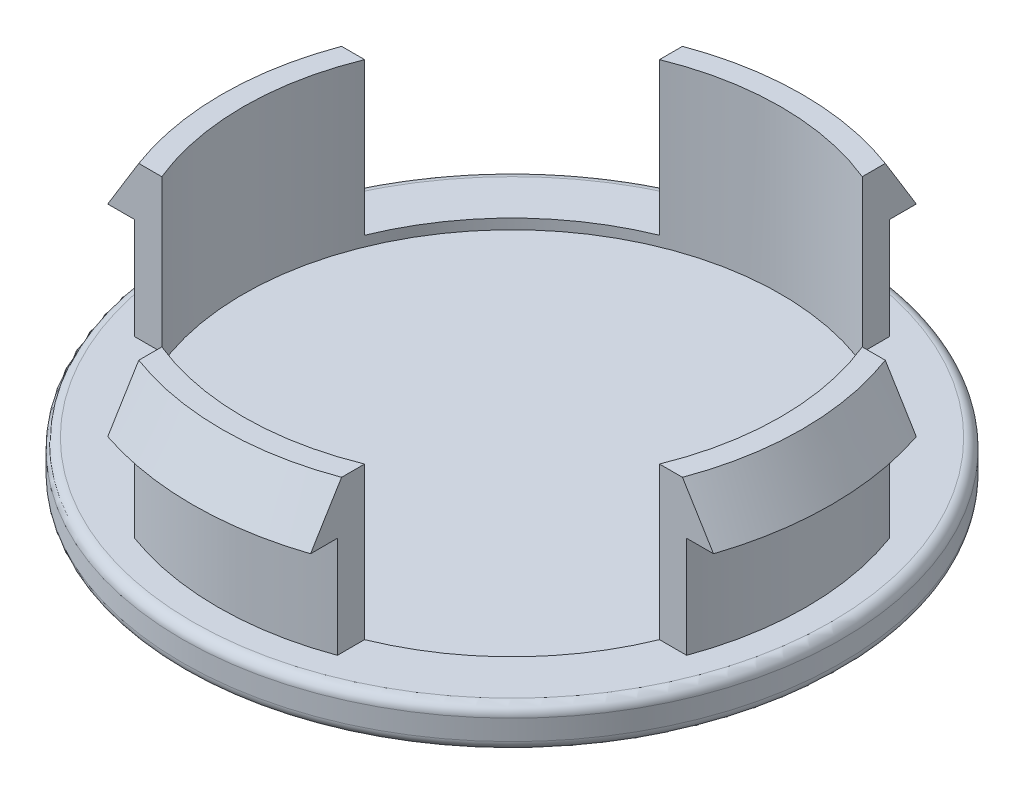
ISO-10303-21;
HEADER;
FILE_DESCRIPTION(('STEP AP214'),'2;1');
FILE_NAME('part.step','',(''),(''),'','','');
FILE_SCHEMA(('AUTOMOTIVE_DESIGN { 1 0 10303 214 1 1 1 1 }'));
ENDSEC;
DATA;
#1=APPLICATION_CONTEXT('core data for automotive mechanical design processes');
#2=APPLICATION_PROTOCOL_DEFINITION('international standard','automotive_design',2000,#1);
#3=PRODUCT_CONTEXT('',#1,'mechanical');
#4=PRODUCT('Part','Part','',(#3));
#5=PRODUCT_RELATED_PRODUCT_CATEGORY('part','',(#4));
#6=PRODUCT_DEFINITION_FORMATION('','',#4);
#7=PRODUCT_DEFINITION_CONTEXT('part definition',#1,'design');
#8=PRODUCT_DEFINITION('design','',#6,#7);
#9=PRODUCT_DEFINITION_SHAPE('','',#8);
#10=(LENGTH_UNIT() NAMED_UNIT(*) SI_UNIT(.MILLI.,.METRE.));
#11=(NAMED_UNIT(*) PLANE_ANGLE_UNIT() SI_UNIT($,.RADIAN.));
#12=(NAMED_UNIT(*) SI_UNIT($,.STERADIAN.) SOLID_ANGLE_UNIT());
#13=UNCERTAINTY_MEASURE_WITH_UNIT(LENGTH_MEASURE(1.E-05),#10,'distance_accuracy_value','');
#14=(GEOMETRIC_REPRESENTATION_CONTEXT(3) GLOBAL_UNCERTAINTY_ASSIGNED_CONTEXT((#13)) GLOBAL_UNIT_ASSIGNED_CONTEXT((#10,
#11,#12)) REPRESENTATION_CONTEXT('',''));
#15=CARTESIAN_POINT('',(0.,0.,0.));
#16=DIRECTION('',(0.,0.,1.));
#17=DIRECTION('',(1.,0.,0.));
#18=AXIS2_PLACEMENT_3D('',#15,#16,#17);
#19=CARTESIAN_POINT('',(0.,0.,0.));
#20=DIRECTION('',(0.,1.,0.));
#21=DIRECTION('',(0.,0.,1.));
#22=AXIS2_PLACEMENT_3D('',#19,#20,#21);
#23=CYLINDRICAL_SURFACE('',#22,26.5);
#24=CARTESIAN_POINT('',(0.,3.,0.));
#25=DIRECTION('',(0.,1.,0.));
#26=DIRECTION('',(0.,0.,1.));
#27=AXIS2_PLACEMENT_3D('',#24,#25,#26);
#28=CIRCLE('',#27,26.5);
#29=CARTESIAN_POINT('',(0.,3.,26.5));
#30=VERTEX_POINT('',#29);
#31=EDGE_CURVE('E11',#30,#30,#28,.T.);
#32=ORIENTED_EDGE('',*,*,#31,.F.);
#33=EDGE_LOOP('',(#32));
#34=FACE_BOUND('',#33,.T.);
#35=CARTESIAN_POINT('',(0.,19.,0.));
#36=DIRECTION('',(0.,1.,0.));
#37=DIRECTION('',(0.,0.,1.));
#38=AXIS2_PLACEMENT_3D('',#35,#36,#37);
#39=CIRCLE('',#38,26.5);
#40=CARTESIAN_POINT('',(10.,19.,-24.5407823836161));
#41=VERTEX_POINT('',#40);
#42=CARTESIAN_POINT('',(-10.,19.,-24.5407823836161));
#43=VERTEX_POINT('',#42);
#44=EDGE_CURVE('E45',#41,#43,#39,.T.);
#45=ORIENTED_EDGE('',*,*,#44,.T.);
#46=DIRECTION('',(0.,1.,0.));
#47=VECTOR('',#46,1.);
#48=CARTESIAN_POINT('',(-10.,-39.6378852958112,-24.5407823836161));
#49=LINE('',#48,#47);
#50=CARTESIAN_POINT('',(-10.,4.,-24.5407823836161));
#51=VERTEX_POINT('',#50);
#52=EDGE_CURVE('E220',#51,#43,#49,.T.);
#53=ORIENTED_EDGE('',*,*,#52,.F.);
#54=CARTESIAN_POINT('',(0.,4.,0.));
#55=DIRECTION('',(0.,1.,0.));
#56=DIRECTION('',(0.,0.,1.));
#57=AXIS2_PLACEMENT_3D('',#54,#55,#56);
#58=CIRCLE('',#57,26.5);
#59=CARTESIAN_POINT('',(-24.5407823836161,4.,-9.99999999999999));
#60=VERTEX_POINT('',#59);
#61=EDGE_CURVE('E219',#51,#60,#58,.T.);
#62=ORIENTED_EDGE('',*,*,#61,.T.);
#63=DIRECTION('',(0.,1.,0.));
#64=VECTOR('',#63,1.);
#65=CARTESIAN_POINT('',(-24.5407823836161,-39.6378852958112,-9.99999999999999));
#66=LINE('',#65,#64);
#67=CARTESIAN_POINT('',(-24.5407823836161,19.,-9.99999999999999));
#68=VERTEX_POINT('',#67);
#69=EDGE_CURVE('E204',#60,#68,#66,.T.);
#70=ORIENTED_EDGE('',*,*,#69,.T.);
#71=CARTESIAN_POINT('',(-24.5407823836161,19.,10.));
#72=VERTEX_POINT('',#71);
#73=EDGE_CURVE('E216',#68,#72,#39,.T.);
#74=ORIENTED_EDGE('',*,*,#73,.T.);
#75=DIRECTION('',(0.,1.,0.));
#76=VECTOR('',#75,1.);
#77=CARTESIAN_POINT('',(-24.5407823836161,-39.6378852958112,10.));
#78=LINE('',#77,#76);
#79=CARTESIAN_POINT('',(-24.5407823836161,4.,10.));
#80=VERTEX_POINT('',#79);
#81=EDGE_CURVE('E517',#80,#72,#78,.T.);
#82=ORIENTED_EDGE('',*,*,#81,.F.);
#83=CARTESIAN_POINT('',(0.,4.,0.));
#84=DIRECTION('',(0.,1.,0.));
#85=DIRECTION('',(0.,0.,1.));
#86=AXIS2_PLACEMENT_3D('',#83,#84,#85);
#87=CIRCLE('',#86,26.5);
#88=CARTESIAN_POINT('',(-9.99999999999999,4.,24.5407823836161));
#89=VERTEX_POINT('',#88);
#90=EDGE_CURVE('E532',#80,#89,#87,.T.);
#91=ORIENTED_EDGE('',*,*,#90,.T.);
#92=DIRECTION('',(0.,1.,0.));
#93=VECTOR('',#92,1.);
#94=CARTESIAN_POINT('',(-9.99999999999999,-39.6378852958112,24.5407823836161));
#95=LINE('',#94,#93);
#96=CARTESIAN_POINT('',(-9.99999999999999,19.,24.5407823836161));
#97=VERTEX_POINT('',#96);
#98=EDGE_CURVE('E515',#89,#97,#95,.T.);
#99=ORIENTED_EDGE('',*,*,#98,.T.);
#100=CARTESIAN_POINT('',(10.,19.,24.5407823836161));
#101=VERTEX_POINT('',#100);
#102=EDGE_CURVE('E226',#97,#101,#39,.T.);
#103=ORIENTED_EDGE('',*,*,#102,.T.);
#104=DIRECTION('',(0.,1.,0.));
#105=VECTOR('',#104,1.);
#106=CARTESIAN_POINT('',(10.,-39.6378852958112,24.5407823836161));
#107=LINE('',#106,#105);
#108=CARTESIAN_POINT('',(10.,4.,24.5407823836161));
#109=VERTEX_POINT('',#108);
#110=EDGE_CURVE('E494',#109,#101,#107,.T.);
#111=ORIENTED_EDGE('',*,*,#110,.F.);
#112=CARTESIAN_POINT('',(0.,4.,0.));
#113=DIRECTION('',(0.,1.,0.));
#114=DIRECTION('',(0.,0.,1.));
#115=AXIS2_PLACEMENT_3D('',#112,#113,#114);
#116=CIRCLE('',#115,26.5);
#117=CARTESIAN_POINT('',(24.5407823836161,4.,10.));
#118=VERTEX_POINT('',#117);
#119=EDGE_CURVE('E496',#109,#118,#116,.T.);
#120=ORIENTED_EDGE('',*,*,#119,.T.);
#121=DIRECTION('',(0.,1.,0.));
#122=VECTOR('',#121,1.);
#123=CARTESIAN_POINT('',(24.5407823836161,-39.6378852958112,10.));
#124=LINE('',#123,#122);
#125=CARTESIAN_POINT('',(24.5407823836161,19.,10.));
#126=VERTEX_POINT('',#125);
#127=EDGE_CURVE('E504',#118,#126,#124,.T.);
#128=ORIENTED_EDGE('',*,*,#127,.T.);
#129=CARTESIAN_POINT('',(24.5407823836161,19.,-10.));
#130=VERTEX_POINT('',#129);
#131=EDGE_CURVE('E227',#126,#130,#39,.T.);
#132=ORIENTED_EDGE('',*,*,#131,.T.);
#133=DIRECTION('',(0.,1.,0.));
#134=VECTOR('',#133,1.);
#135=CARTESIAN_POINT('',(24.5407823836161,-39.6378852958112,-10.));
#136=LINE('',#135,#134);
#137=CARTESIAN_POINT('',(24.5407823836161,4.,-10.));
#138=VERTEX_POINT('',#137);
#139=EDGE_CURVE('E374',#138,#130,#136,.T.);
#140=ORIENTED_EDGE('',*,*,#139,.F.);
#141=CARTESIAN_POINT('',(0.,4.,0.));
#142=DIRECTION('',(0.,1.,0.));
#143=DIRECTION('',(0.,0.,1.));
#144=AXIS2_PLACEMENT_3D('',#141,#142,#143);
#145=CIRCLE('',#144,26.5);
#146=CARTESIAN_POINT('',(10.,4.,-24.5407823836161));
#147=VERTEX_POINT('',#146);
#148=EDGE_CURVE('E371',#138,#147,#145,.T.);
#149=ORIENTED_EDGE('',*,*,#148,.T.);
#150=DIRECTION('',(0.,1.,0.));
#151=VECTOR('',#150,1.);
#152=CARTESIAN_POINT('',(10.,-39.6378852958112,-24.5407823836161));
#153=LINE('',#152,#151);
#154=EDGE_CURVE('E377',#147,#41,#153,.T.);
#155=ORIENTED_EDGE('',*,*,#154,.T.);
#156=EDGE_LOOP('',(#45,#53,#62,#70,#74,#82,#91,#99,#103,#111,#120,#128,#132,#140,#149,#155));
#157=FACE_BOUND('',#156,.T.);
#158=ADVANCED_FACE('F37',(#34,#157),#23,.F.);
#159=CARTESIAN_POINT('',(-28.6132486540518,19.,0.));
#160=DIRECTION('',(0.,1.,0.));
#161=DIRECTION('',(0.,0.,1.));
#162=AXIS2_PLACEMENT_3D('',#159,#160,#161);
#163=PLANE('',#162);
#164=CARTESIAN_POINT('',(0.,19.,0.));
#165=DIRECTION('',(0.,1.,0.));
#166=DIRECTION('',(0.,0.,1.));
#167=AXIS2_PLACEMENT_3D('',#164,#165,#166);
#168=CIRCLE('',#167,28.6132486540518);
#169=CARTESIAN_POINT('',(10.,19.,-26.8089163999331));
#170=VERTEX_POINT('',#169);
#171=CARTESIAN_POINT('',(-10.,19.,-26.8089163999331));
#172=VERTEX_POINT('',#171);
#173=EDGE_CURVE('E229',#170,#172,#168,.T.);
#174=ORIENTED_EDGE('',*,*,#173,.T.);
#175=DIRECTION('',(0.,0.,1.));
#176=VECTOR('',#175,1.);
#177=CARTESIAN_POINT('',(-9.99999999999999,19.,0.));
#178=LINE('',#177,#176);
#179=EDGE_CURVE('E211',#172,#43,#178,.T.);
#180=ORIENTED_EDGE('',*,*,#179,.T.);
#181=ORIENTED_EDGE('',*,*,#44,.F.);
#182=DIRECTION('',(0.,0.,1.));
#183=VECTOR('',#182,1.);
#184=CARTESIAN_POINT('',(9.99999999999999,19.,0.));
#185=LINE('',#184,#183);
#186=EDGE_CURVE('E379',#170,#41,#185,.T.);
#187=ORIENTED_EDGE('',*,*,#186,.F.);
#188=EDGE_LOOP('',(#174,#180,#181,#187));
#189=FACE_BOUND('',#188,.T.);
#190=ADVANCED_FACE('F326',(#189),#163,.T.);
#191=CARTESIAN_POINT('',(0.,19.,0.));
#192=DIRECTION('',(0.,-1.,0.));
#193=DIRECTION('',(0.,0.,-1.));
#194=AXIS2_PLACEMENT_3D('',#191,#192,#193);
#195=CONICAL_SURFACE('',#194,28.6132486540518,0.523598775598303);
#196=CARTESIAN_POINT('',(0.,14.,0.));
#197=DIRECTION('',(0.,1.,0.));
#198=DIRECTION('',(0.,0.,1.));
#199=AXIS2_PLACEMENT_3D('',#196,#197,#198);
#200=CIRCLE('',#199,31.5);
#201=CARTESIAN_POINT('',(9.99999999999999,14.,-29.8705540624877));
#202=VERTEX_POINT('',#201);
#203=CARTESIAN_POINT('',(-10.,14.,-29.8705540624877));
#204=VERTEX_POINT('',#203);
#205=EDGE_CURVE('E234',#202,#204,#200,.T.);
#206=ORIENTED_EDGE('',*,*,#205,.T.);
#207=CARTESIAN_POINT('',(-10.,0.53803371769992,-37.9777721794444));
#208=CARTESIAN_POINT('',(-10.,1.71069904858378,-37.2776349244702));
#209=CARTESIAN_POINT('',(-10.,2.88283064665295,-36.5766018971294));
#210=CARTESIAN_POINT('',(-10.,5.22577921730675,-35.1723414017115));
#211=CARTESIAN_POINT('',(-10.,6.39659618923228,-34.4691139325349));
#212=CARTESIAN_POINT('',(-10.,8.73660645610639,-33.060098917814));
#213=CARTESIAN_POINT('',(-10.,9.90579983215849,-32.3543115070117));
#214=CARTESIAN_POINT('',(-10.,12.2422864300774,-30.9395986679945));
#215=CARTESIAN_POINT('',(-10.,13.4095796530463,-30.2306732416007));
#216=CARTESIAN_POINT('',(-10.,15.7418796152031,-28.8089553369));
#217=CARTESIAN_POINT('',(-10.,16.9068862522619,-28.0961626909877));
#218=CARTESIAN_POINT('',(-10.,19.2339730871932,-26.6658236976814));
#219=CARTESIAN_POINT('',(-10.,20.3960532991588,-25.9482773732411));
#220=CARTESIAN_POINT('',(-10.,22.1364000776036,-24.8674228954663));
#221=CARTESIAN_POINT('',(-10.,22.7160690395561,-24.506372420491));
#222=CARTESIAN_POINT('',(-10.,23.8743364527512,-23.7825593471346));
#223=CARTESIAN_POINT('',(-10.,24.4529349052358,-23.4197967507415));
#224=CARTESIAN_POINT('',(-10.,25.6089173541076,-22.6923200552483));
#225=CARTESIAN_POINT('',(-10.,26.1863013307351,-22.3276059247333));
#226=CARTESIAN_POINT('',(-10.,27.3396479877337,-21.5959325867297));
#227=CARTESIAN_POINT('',(-10.,27.915610662407,-21.2289733702614));
#228=CARTESIAN_POINT('',(-10.,28.490761639856,-20.8607433765375));
#229=B_SPLINE_CURVE_WITH_KNOTS('',3,(#207,#208,#209,#210,#211,#212,#213,#214,#215,#216,#217,
#218,#219,#220,#221,#222,#223,#224,#225,#226,#227,#228),.UNSPECIFIED.,.F.,.F.,(4,2,2,2,2,2,2,2,
2,2,4),(0.,4.09732029107365,8.19464263543744,12.2917523603476,16.3888597080831,20.4861460661348,
24.5834126543644,26.6321566694296,28.6808983060587,30.7296730221881,32.7784559382096),.UNSPECIFIED.);
#230=EDGE_CURVE('E519',#204,#172,#229,.T.);
#231=ORIENTED_EDGE('',*,*,#230,.T.);
#232=ORIENTED_EDGE('',*,*,#173,.F.);
#233=CARTESIAN_POINT('',(10.,0.53803371769992,-37.9777721794444));
#234=CARTESIAN_POINT('',(10.,1.71069904858378,-37.2776349244702));
#235=CARTESIAN_POINT('',(10.,2.88283064665295,-36.5766018971294));
#236=CARTESIAN_POINT('',(10.,5.22577921730675,-35.1723414017115));
#237=CARTESIAN_POINT('',(10.,6.39659618923228,-34.4691139325349));
#238=CARTESIAN_POINT('',(10.,8.73660645610639,-33.060098917814));
#239=CARTESIAN_POINT('',(10.,9.90579983215849,-32.3543115070117));
#240=CARTESIAN_POINT('',(10.,12.2422864300774,-30.9395986679945));
#241=CARTESIAN_POINT('',(10.,13.4095796530463,-30.2306732416007));
#242=CARTESIAN_POINT('',(10.,15.7418796152031,-28.8089553369));
#243=CARTESIAN_POINT('',(10.,16.9068862522619,-28.0961626909877));
#244=CARTESIAN_POINT('',(10.,19.2339730871932,-26.6658236976814));
#245=CARTESIAN_POINT('',(10.,20.3960532991588,-25.9482773732411));
#246=CARTESIAN_POINT('',(10.,22.1364000776036,-24.8674228954663));
#247=CARTESIAN_POINT('',(10.,22.7160690395561,-24.506372420491));
#248=CARTESIAN_POINT('',(10.,23.8743364527512,-23.7825593471346));
#249=CARTESIAN_POINT('',(10.,24.4529349052358,-23.4197967507415));
#250=CARTESIAN_POINT('',(10.,25.6089173541076,-22.6923200552483));
#251=CARTESIAN_POINT('',(10.,26.1863013307351,-22.3276059247333));
#252=CARTESIAN_POINT('',(10.,27.3396479877337,-21.5959325867297));
#253=CARTESIAN_POINT('',(10.,27.915610662407,-21.2289733702614));
#254=CARTESIAN_POINT('',(10.,28.490761639856,-20.8607433765375));
#255=B_SPLINE_CURVE_WITH_KNOTS('',3,(#233,#234,#235,#236,#237,#238,#239,#240,#241,#242,#243,
#244,#245,#246,#247,#248,#249,#250,#251,#252,#253,#254),.UNSPECIFIED.,.F.,.F.,(4,2,2,2,2,2,2,2,
2,2,4),(0.,4.09732029107365,8.19464263543744,12.2917523603476,16.3888597080831,20.4861460661348,
24.5834126543644,26.6321566694296,28.6808983060587,30.7296730221881,32.7784559382096),.UNSPECIFIED.);
#256=EDGE_CURVE('E397',#202,#170,#255,.T.);
#257=ORIENTED_EDGE('',*,*,#256,.F.);
#258=EDGE_LOOP('',(#206,#231,#232,#257));
#259=FACE_BOUND('',#258,.T.);
#260=ADVANCED_FACE('F317',(#259),#195,.T.);
#261=CARTESIAN_POINT('',(-29.,14.,0.));
#262=DIRECTION('',(0.,-1.,0.));
#263=DIRECTION('',(0.,0.,-1.));
#264=AXIS2_PLACEMENT_3D('',#261,#262,#263);
#265=PLANE('',#264);
#266=CARTESIAN_POINT('',(0.,14.,0.));
#267=DIRECTION('',(0.,1.,0.));
#268=DIRECTION('',(0.,0.,1.));
#269=AXIS2_PLACEMENT_3D('',#266,#267,#268);
#270=CIRCLE('',#269,29.);
#271=CARTESIAN_POINT('',(9.99999999999999,14.,-27.2213151776324));
#272=VERTEX_POINT('',#271);
#273=CARTESIAN_POINT('',(-9.99999999999999,14.,-27.2213151776324));
#274=VERTEX_POINT('',#273);
#275=EDGE_CURVE('E239',#272,#274,#270,.T.);
#276=ORIENTED_EDGE('',*,*,#275,.T.);
#277=DIRECTION('',(0.,0.,-1.));
#278=VECTOR('',#277,1.);
#279=CARTESIAN_POINT('',(-9.99999999999999,14.,0.));
#280=LINE('',#279,#278);
#281=EDGE_CURVE('E562',#274,#204,#280,.T.);
#282=ORIENTED_EDGE('',*,*,#281,.T.);
#283=ORIENTED_EDGE('',*,*,#205,.F.);
#284=DIRECTION('',(0.,0.,-1.));
#285=VECTOR('',#284,1.);
#286=CARTESIAN_POINT('',(9.99999999999999,14.,0.));
#287=LINE('',#286,#285);
#288=EDGE_CURVE('E395',#272,#202,#287,.T.);
#289=ORIENTED_EDGE('',*,*,#288,.F.);
#290=EDGE_LOOP('',(#276,#282,#283,#289));
#291=FACE_BOUND('',#290,.T.);
#292=ADVANCED_FACE('F310',(#291),#265,.T.);
#293=CARTESIAN_POINT('',(0.,0.,0.));
#294=DIRECTION('',(0.,1.,0.));
#295=DIRECTION('',(0.,0.,1.));
#296=AXIS2_PLACEMENT_3D('',#293,#294,#295);
#297=CYLINDRICAL_SURFACE('',#296,29.);
#298=CARTESIAN_POINT('',(0.,3.99999999999999,0.));
#299=DIRECTION('',(0.,1.,0.));
#300=DIRECTION('',(0.,0.,1.));
#301=AXIS2_PLACEMENT_3D('',#298,#299,#300);
#302=CIRCLE('',#301,29.);
#303=CARTESIAN_POINT('',(10.,4.,-27.2213151776324));
#304=VERTEX_POINT('',#303);
#305=CARTESIAN_POINT('',(-10.,3.99999999999999,-27.2213151776324));
#306=VERTEX_POINT('',#305);
#307=EDGE_CURVE('E244',#304,#306,#302,.T.);
#308=ORIENTED_EDGE('',*,*,#307,.T.);
#309=DIRECTION('',(0.,1.,0.));
#310=VECTOR('',#309,1.);
#311=CARTESIAN_POINT('',(-9.99999999999999,0.,-27.2213151776324));
#312=LINE('',#311,#310);
#313=EDGE_CURVE('E363',#306,#274,#312,.T.);
#314=ORIENTED_EDGE('',*,*,#313,.T.);
#315=ORIENTED_EDGE('',*,*,#275,.F.);
#316=DIRECTION('',(0.,1.,0.));
#317=VECTOR('',#316,1.);
#318=CARTESIAN_POINT('',(9.99999999999999,0.,-27.2213151776324));
#319=LINE('',#318,#317);
#320=EDGE_CURVE('E364',#304,#272,#319,.T.);
#321=ORIENTED_EDGE('',*,*,#320,.F.);
#322=EDGE_LOOP('',(#308,#314,#315,#321));
#323=FACE_BOUND('',#322,.T.);
#324=ADVANCED_FACE('F306',(#323),#297,.T.);
#325=DIRECTION('',(1.,0.,0.));
#326=VECTOR('',#325,1.);
#327=CARTESIAN_POINT('',(0.,19.,-9.99999999999999));
#328=LINE('',#327,#326);
#329=CARTESIAN_POINT('',(-26.8089163999331,19.,-9.99999999999999));
#330=VERTEX_POINT('',#329);
#331=EDGE_CURVE('E201',#330,#68,#328,.T.);
#332=ORIENTED_EDGE('',*,*,#331,.F.);
#333=CARTESIAN_POINT('',(-26.8089163999331,19.,10.));
#334=VERTEX_POINT('',#333);
#335=EDGE_CURVE('E232',#330,#334,#168,.T.);
#336=ORIENTED_EDGE('',*,*,#335,.T.);
#337=DIRECTION('',(1.,0.,0.));
#338=VECTOR('',#337,1.);
#339=CARTESIAN_POINT('',(0.,19.,10.));
#340=LINE('',#339,#338);
#341=EDGE_CURVE('E225',#334,#72,#340,.T.);
#342=ORIENTED_EDGE('',*,*,#341,.T.);
#343=ORIENTED_EDGE('',*,*,#73,.F.);
#344=EDGE_LOOP('',(#332,#336,#342,#343));
#345=FACE_BOUND('',#344,.T.);
#346=ADVANCED_FACE('F223',(#345),#163,.T.);
#347=CARTESIAN_POINT('',(-37.9777721794444,0.538033717699919,-9.99999999999999));
#348=CARTESIAN_POINT('',(-37.2776349244702,1.71069904858378,-9.99999999999999));
#349=CARTESIAN_POINT('',(-36.5766018971294,2.88283064665295,-9.99999999999999));
#350=CARTESIAN_POINT('',(-35.1723414017115,5.22577921730675,-9.99999999999999));
#351=CARTESIAN_POINT('',(-34.4691139325349,6.39659618923228,-9.99999999999999));
#352=CARTESIAN_POINT('',(-33.060098917814,8.73660645610639,-9.99999999999999));
#353=CARTESIAN_POINT('',(-32.3543115070117,9.90579983215849,-9.99999999999999));
#354=CARTESIAN_POINT('',(-30.9395986679945,12.2422864300774,-9.99999999999999));
#355=CARTESIAN_POINT('',(-30.2306732416007,13.4095796530463,-9.99999999999999));
#356=CARTESIAN_POINT('',(-28.8089553369,15.7418796152031,-9.99999999999999));
#357=CARTESIAN_POINT('',(-28.0961626909877,16.9068862522619,-9.99999999999999));
#358=CARTESIAN_POINT('',(-26.6658236976814,19.2339730871932,-9.99999999999999));
#359=CARTESIAN_POINT('',(-25.9482773732411,20.3960532991588,-9.99999999999999));
#360=CARTESIAN_POINT('',(-24.8674228954663,22.1364000776036,-9.99999999999999));
#361=CARTESIAN_POINT('',(-24.506372420491,22.7160690395561,-9.99999999999999));
#362=CARTESIAN_POINT('',(-23.7825593471346,23.8743364527512,-9.99999999999999));
#363=CARTESIAN_POINT('',(-23.4197967507415,24.4529349052358,-9.99999999999999));
#364=CARTESIAN_POINT('',(-22.6923200552483,25.6089173541076,-9.99999999999999));
#365=CARTESIAN_POINT('',(-22.3276059247333,26.1863013307351,-9.99999999999999));
#366=CARTESIAN_POINT('',(-21.5959325867297,27.3396479877337,-9.99999999999999));
#367=CARTESIAN_POINT('',(-21.2289733702614,27.915610662407,-9.99999999999999));
#368=CARTESIAN_POINT('',(-20.8607433765376,28.490761639856,-9.99999999999999));
#369=B_SPLINE_CURVE_WITH_KNOTS('',3,(#347,#348,#349,#350,#351,#352,#353,#354,#355,#356,#357,
#358,#359,#360,#361,#362,#363,#364,#365,#366,#367,#368),.UNSPECIFIED.,.F.,.F.,(4,2,2,2,2,2,2,2,
2,2,4),(0.,4.09732029107365,8.19464263543744,12.2917523603476,16.3888597080831,20.4861460661349,
24.5834126543644,26.6321566694296,28.6808983060587,30.7296730221881,32.7784559382096),.UNSPECIFIED.);
#370=CARTESIAN_POINT('',(-29.8705540624877,14.,-9.99999999999999));
#371=VERTEX_POINT('',#370);
#372=EDGE_CURVE('E207',#371,#330,#369,.T.);
#373=ORIENTED_EDGE('',*,*,#372,.F.);
#374=CARTESIAN_POINT('',(-29.8705540624877,14.,10.));
#375=VERTEX_POINT('',#374);
#376=EDGE_CURVE('E237',#371,#375,#200,.T.);
#377=ORIENTED_EDGE('',*,*,#376,.T.);
#378=CARTESIAN_POINT('',(-37.9777721794444,0.538033717699917,10.));
#379=CARTESIAN_POINT('',(-37.2776349244702,1.71069904858378,10.));
#380=CARTESIAN_POINT('',(-36.5766018971294,2.88283064665295,10.));
#381=CARTESIAN_POINT('',(-35.1723414017115,5.22577921730675,10.));
#382=CARTESIAN_POINT('',(-34.4691139325349,6.39659618923228,10.));
#383=CARTESIAN_POINT('',(-33.060098917814,8.73660645610639,10.));
#384=CARTESIAN_POINT('',(-32.3543115070117,9.90579983215849,10.));
#385=CARTESIAN_POINT('',(-30.9395986679945,12.2422864300774,10.));
#386=CARTESIAN_POINT('',(-30.2306732416007,13.4095796530463,10.));
#387=CARTESIAN_POINT('',(-28.8089553369,15.7418796152031,10.));
#388=CARTESIAN_POINT('',(-28.0961626909877,16.9068862522619,10.));
#389=CARTESIAN_POINT('',(-26.6658236976814,19.2339730871932,10.));
#390=CARTESIAN_POINT('',(-25.9482773732411,20.3960532991588,10.));
#391=CARTESIAN_POINT('',(-24.8674228954663,22.1364000776036,10.));
#392=CARTESIAN_POINT('',(-24.506372420491,22.7160690395561,10.));
#393=CARTESIAN_POINT('',(-23.7825593471345,23.8743364527512,10.));
#394=CARTESIAN_POINT('',(-23.4197967507415,24.4529349052358,10.));
#395=CARTESIAN_POINT('',(-22.6923200552483,25.6089173541076,10.));
#396=CARTESIAN_POINT('',(-22.3276059247333,26.1863013307351,10.));
#397=CARTESIAN_POINT('',(-21.5959325867297,27.3396479877337,10.));
#398=CARTESIAN_POINT('',(-21.2289733702614,27.915610662407,10.));
#399=CARTESIAN_POINT('',(-20.8607433765375,28.490761639856,10.));
#400=B_SPLINE_CURVE_WITH_KNOTS('',3,(#378,#379,#380,#381,#382,#383,#384,#385,#386,#387,#388,
#389,#390,#391,#392,#393,#394,#395,#396,#397,#398,#399),.UNSPECIFIED.,.F.,.F.,(4,2,2,2,2,2,2,2,
2,2,4),(0.,4.09732029107365,8.19464263543744,12.2917523603476,16.3888597080831,20.4861460661349,
24.5834126543644,26.6321566694296,28.6808983060587,30.7296730221881,32.7784559382096),.UNSPECIFIED.);
#401=EDGE_CURVE('E421',#375,#334,#400,.T.);
#402=ORIENTED_EDGE('',*,*,#401,.T.);
#403=ORIENTED_EDGE('',*,*,#335,.F.);
#404=EDGE_LOOP('',(#373,#377,#402,#403));
#405=FACE_BOUND('',#404,.T.);
#406=ADVANCED_FACE('F349',(#405),#195,.T.);
#407=DIRECTION('',(-1.,0.,0.));
#408=VECTOR('',#407,1.);
#409=CARTESIAN_POINT('',(-29.,14.,-9.99999999999999));
#410=LINE('',#409,#408);
#411=CARTESIAN_POINT('',(-27.2213151776324,14.,-9.99999999999999));
#412=VERTEX_POINT('',#411);
#413=EDGE_CURVE('E541',#412,#371,#410,.T.);
#414=ORIENTED_EDGE('',*,*,#413,.F.);
#415=CARTESIAN_POINT('',(-27.2213151776324,14.,10.));
#416=VERTEX_POINT('',#415);
#417=EDGE_CURVE('E242',#412,#416,#270,.T.);
#418=ORIENTED_EDGE('',*,*,#417,.T.);
#419=DIRECTION('',(-1.,0.,0.));
#420=VECTOR('',#419,1.);
#421=CARTESIAN_POINT('',(-29.,14.,10.));
#422=LINE('',#421,#420);
#423=EDGE_CURVE('E429',#416,#375,#422,.T.);
#424=ORIENTED_EDGE('',*,*,#423,.T.);
#425=ORIENTED_EDGE('',*,*,#376,.F.);
#426=EDGE_LOOP('',(#414,#418,#424,#425));
#427=FACE_BOUND('',#426,.T.);
#428=ADVANCED_FACE('F322',(#427),#265,.T.);
#429=DIRECTION('',(0.,1.,0.));
#430=VECTOR('',#429,1.);
#431=CARTESIAN_POINT('',(-27.2213151776324,0.,-9.99999999999999));
#432=LINE('',#431,#430);
#433=CARTESIAN_POINT('',(-27.2213151776324,4.,-9.99999999999999));
#434=VERTEX_POINT('',#433);
#435=EDGE_CURVE('E540',#434,#412,#432,.T.);
#436=ORIENTED_EDGE('',*,*,#435,.F.);
#437=CARTESIAN_POINT('',(-27.2213151776324,3.99999999999999,10.));
#438=VERTEX_POINT('',#437);
#439=EDGE_CURVE('E60',#434,#438,#302,.T.);
#440=ORIENTED_EDGE('',*,*,#439,.T.);
#441=DIRECTION('',(0.,1.,0.));
#442=VECTOR('',#441,1.);
#443=CARTESIAN_POINT('',(-27.2213151776324,0.,10.));
#444=LINE('',#443,#442);
#445=EDGE_CURVE('E433',#438,#416,#444,.T.);
#446=ORIENTED_EDGE('',*,*,#445,.T.);
#447=ORIENTED_EDGE('',*,*,#417,.F.);
#448=EDGE_LOOP('',(#436,#440,#446,#447));
#449=FACE_BOUND('',#448,.T.);
#450=ADVANCED_FACE('F340',(#449),#297,.T.);
#451=DIRECTION('',(0.,0.,-1.));
#452=VECTOR('',#451,1.);
#453=CARTESIAN_POINT('',(-9.99999999999999,19.,0.));
#454=LINE('',#453,#452);
#455=CARTESIAN_POINT('',(-9.99999999999999,19.,26.8089163999331));
#456=VERTEX_POINT('',#455);
#457=EDGE_CURVE('E512',#456,#97,#454,.T.);
#458=ORIENTED_EDGE('',*,*,#457,.F.);
#459=CARTESIAN_POINT('',(10.,19.,26.8089163999331));
#460=VERTEX_POINT('',#459);
#461=EDGE_CURVE('E475',#456,#460,#168,.T.);
#462=ORIENTED_EDGE('',*,*,#461,.T.);
#463=DIRECTION('',(0.,0.,-1.));
#464=VECTOR('',#463,1.);
#465=CARTESIAN_POINT('',(9.99999999999999,19.,0.));
#466=LINE('',#465,#464);
#467=EDGE_CURVE('E430',#460,#101,#466,.T.);
#468=ORIENTED_EDGE('',*,*,#467,.T.);
#469=ORIENTED_EDGE('',*,*,#102,.F.);
#470=EDGE_LOOP('',(#458,#462,#468,#469));
#471=FACE_BOUND('',#470,.T.);
#472=ADVANCED_FACE('F335',(#471),#163,.T.);
#473=CARTESIAN_POINT('',(-9.99999999999999,3.92368081403601,35.9527565270953));
#474=CARTESIAN_POINT('',(-9.99999999999999,5.09521408140024,35.2506665958291));
#475=CARTESIAN_POINT('',(-9.99999999999999,6.26612149152119,34.5475296177078));
#476=CARTESIAN_POINT('',(-9.99999999999999,8.60636962080832,33.138653236848));
#477=CARTESIAN_POINT('',(-9.99999999999999,9.77571033969964,32.432913833653));
#478=CARTESIAN_POINT('',(-9.99999999999999,12.1124148695572,31.0183819229133));
#479=CARTESIAN_POINT('',(-9.99999999999999,13.2797788332699,30.3095896678125));
#480=CARTESIAN_POINT('',(-9.99999999999999,15.6121868835016,28.8881986647334));
#481=CARTESIAN_POINT('',(-9.99999999999999,16.777230972117,28.1755999201968));
#482=CARTESIAN_POINT('',(-9.99999999999999,19.1045059755668,26.7456288315779));
#483=CARTESIAN_POINT('',(-9.99999999999999,20.2667366761367,26.0282561386048));
#484=CARTESIAN_POINT('',(-9.99999999999999,22.5874980472544,24.5875643264923));
#485=CARTESIAN_POINT('',(-9.99999999999999,23.7460287498104,23.8642452589883));
#486=CARTESIAN_POINT('',(-9.99999999999999,25.4802472257181,22.7734696602662));
#487=CARTESIAN_POINT('',(-9.99999999999999,26.057748454188,22.4088958835579));
#488=CARTESIAN_POINT('',(-9.99999999999999,27.2113466818007,21.6775352593463));
#489=CARTESIAN_POINT('',(-9.99999999999999,27.7874436840362,21.3107484167237));
#490=CARTESIAN_POINT('',(-9.99999999999999,28.938026870799,20.5746184596295));
#491=CARTESIAN_POINT('',(-9.99999999999999,29.5125130082962,20.2052752715938));
#492=CARTESIAN_POINT('',(-9.99999999999999,30.6595616759573,19.4636051819272));
#493=CARTESIAN_POINT('',(-9.99999999999999,31.2321241914783,19.0912782576563));
#494=CARTESIAN_POINT('',(-9.99999999999999,31.803572493779,18.7172433001158));
#495=B_SPLINE_CURVE_WITH_KNOTS('',3,(#473,#474,#475,#476,#477,#478,#479,#480,#481,#482,#483,
#484,#485,#486,#487,#488,#489,#490,#491,#492,#493,#494),.UNSPECIFIED.,.F.,.F.,(4,2,2,2,2,2,2,2,
2,2,4),(0.,4.09741344256984,8.1948276038969,12.2919092122575,16.3889871166004,20.4863678066193,
24.5837129543752,26.6325610999287,28.6814047287601,30.7303075644891,32.7792259616017),.UNSPECIFIED.);
#496=CARTESIAN_POINT('',(-9.99999999999999,14.,29.8705540624877));
#497=VERTEX_POINT('',#496);
#498=EDGE_CURVE('E435',#497,#456,#495,.T.);
#499=ORIENTED_EDGE('',*,*,#498,.F.);
#500=CARTESIAN_POINT('',(10.,14.,29.8705540624877));
#501=VERTEX_POINT('',#500);
#502=EDGE_CURVE('E413',#497,#501,#200,.T.);
#503=ORIENTED_EDGE('',*,*,#502,.T.);
#504=CARTESIAN_POINT('',(10.,3.923680814036,35.9527565270954));
#505=CARTESIAN_POINT('',(10.,5.09521408140023,35.2506665958291));
#506=CARTESIAN_POINT('',(10.,6.26612149152118,34.5475296177078));
#507=CARTESIAN_POINT('',(10.,8.60636962080831,33.138653236848));
#508=CARTESIAN_POINT('',(10.,9.77571033969963,32.432913833653));
#509=CARTESIAN_POINT('',(10.,12.1124148695572,31.0183819229133));
#510=CARTESIAN_POINT('',(10.,13.2797788332699,30.3095896678125));
#511=CARTESIAN_POINT('',(10.,15.6121868835016,28.8881986647334));
#512=CARTESIAN_POINT('',(10.,16.777230972117,28.1755999201968));
#513=CARTESIAN_POINT('',(10.,19.1045059755668,26.7456288315779));
#514=CARTESIAN_POINT('',(10.,20.2667366761367,26.0282561386049));
#515=CARTESIAN_POINT('',(10.,22.5874980472544,24.5875643264923));
#516=CARTESIAN_POINT('',(10.,23.7460287498104,23.8642452589883));
#517=CARTESIAN_POINT('',(10.,25.4802472257181,22.7734696602662));
#518=CARTESIAN_POINT('',(10.,26.057748454188,22.4088958835578));
#519=CARTESIAN_POINT('',(10.,27.2113466818007,21.6775352593463));
#520=CARTESIAN_POINT('',(10.,27.7874436840362,21.3107484167237));
#521=CARTESIAN_POINT('',(10.,28.938026870799,20.5746184596295));
#522=CARTESIAN_POINT('',(10.,29.5125130082962,20.2052752715938));
#523=CARTESIAN_POINT('',(10.,30.6595616759573,19.4636051819272));
#524=CARTESIAN_POINT('',(10.,31.2321241914783,19.0912782576563));
#525=CARTESIAN_POINT('',(10.,31.803572493779,18.7172433001158));
#526=B_SPLINE_CURVE_WITH_KNOTS('',3,(#504,#505,#506,#507,#508,#509,#510,#511,#512,#513,#514,
#515,#516,#517,#518,#519,#520,#521,#522,#523,#524,#525),.UNSPECIFIED.,.F.,.F.,(4,2,2,2,2,2,2,2,
2,2,4),(0.,4.09741344256984,8.1948276038969,12.2919092122575,16.3889871166004,20.4863678066193,
24.5837129543753,26.6325610999287,28.6814047287601,30.7303075644891,32.7792259616017),.UNSPECIFIED.);
#527=EDGE_CURVE('E391',#501,#460,#526,.T.);
#528=ORIENTED_EDGE('',*,*,#527,.T.);
#529=ORIENTED_EDGE('',*,*,#461,.F.);
#530=EDGE_LOOP('',(#499,#503,#528,#529));
#531=FACE_BOUND('',#530,.T.);
#532=ADVANCED_FACE('F318',(#531),#195,.T.);
#533=DIRECTION('',(0.,0.,1.));
#534=VECTOR('',#533,1.);
#535=CARTESIAN_POINT('',(-9.99999999999999,14.,0.));
#536=LINE('',#535,#534);
#537=CARTESIAN_POINT('',(-9.99999999999999,14.,27.2213151776324));
#538=VERTEX_POINT('',#537);
#539=EDGE_CURVE('E485',#538,#497,#536,.T.);
#540=ORIENTED_EDGE('',*,*,#539,.F.);
#541=CARTESIAN_POINT('',(10.,14.,27.2213151776324));
#542=VERTEX_POINT('',#541);
#543=EDGE_CURVE('E484',#538,#542,#270,.T.);
#544=ORIENTED_EDGE('',*,*,#543,.T.);
#545=DIRECTION('',(0.,0.,1.));
#546=VECTOR('',#545,1.);
#547=CARTESIAN_POINT('',(9.99999999999999,14.,0.));
#548=LINE('',#547,#546);
#549=EDGE_CURVE('E469',#542,#501,#548,.T.);
#550=ORIENTED_EDGE('',*,*,#549,.T.);
#551=ORIENTED_EDGE('',*,*,#502,.F.);
#552=EDGE_LOOP('',(#540,#544,#550,#551));
#553=FACE_BOUND('',#552,.T.);
#554=ADVANCED_FACE('F311',(#553),#265,.T.);
#555=DIRECTION('',(0.,1.,0.));
#556=VECTOR('',#555,1.);
#557=CARTESIAN_POINT('',(-9.99999999999999,0.,27.2213151776324));
#558=LINE('',#557,#556);
#559=CARTESIAN_POINT('',(-9.99999999999999,4.,27.2213151776324));
#560=VERTEX_POINT('',#559);
#561=EDGE_CURVE('E487',#560,#538,#558,.T.);
#562=ORIENTED_EDGE('',*,*,#561,.F.);
#563=CARTESIAN_POINT('',(10.,3.99999999999999,27.2213151776324));
#564=VERTEX_POINT('',#563);
#565=EDGE_CURVE('E489',#560,#564,#302,.T.);
#566=ORIENTED_EDGE('',*,*,#565,.T.);
#567=DIRECTION('',(0.,1.,0.));
#568=VECTOR('',#567,1.);
#569=CARTESIAN_POINT('',(10.,0.,27.2213151776324));
#570=LINE('',#569,#568);
#571=EDGE_CURVE('E464',#564,#542,#570,.T.);
#572=ORIENTED_EDGE('',*,*,#571,.T.);
#573=ORIENTED_EDGE('',*,*,#543,.F.);
#574=EDGE_LOOP('',(#562,#566,#572,#573));
#575=FACE_BOUND('',#574,.T.);
#576=ADVANCED_FACE('F307',(#575),#297,.T.);
#577=DIRECTION('',(-1.,0.,0.));
#578=VECTOR('',#577,1.);
#579=CARTESIAN_POINT('',(0.,19.,9.99999999999999));
#580=LINE('',#579,#578);
#581=CARTESIAN_POINT('',(26.8089163999331,19.,10.));
#582=VERTEX_POINT('',#581);
#583=EDGE_CURVE('E506',#582,#126,#580,.T.);
#584=ORIENTED_EDGE('',*,*,#583,.F.);
#585=CARTESIAN_POINT('',(26.8089163999331,19.,-10.));
#586=VERTEX_POINT('',#585);
#587=EDGE_CURVE('E233',#582,#586,#168,.T.);
#588=ORIENTED_EDGE('',*,*,#587,.T.);
#589=DIRECTION('',(-1.,0.,0.));
#590=VECTOR('',#589,1.);
#591=CARTESIAN_POINT('',(0.,19.,-10.));
#592=LINE('',#591,#590);
#593=EDGE_CURVE('E388',#586,#130,#592,.T.);
#594=ORIENTED_EDGE('',*,*,#593,.T.);
#595=ORIENTED_EDGE('',*,*,#131,.F.);
#596=EDGE_LOOP('',(#584,#588,#594,#595));
#597=FACE_BOUND('',#596,.T.);
#598=ADVANCED_FACE('F315',(#597),#163,.T.);
#599=CARTESIAN_POINT('',(35.9527565270953,3.92368081403601,10.));
#600=CARTESIAN_POINT('',(35.2506665958291,5.09521408140024,10.));
#601=CARTESIAN_POINT('',(34.5475296177078,6.26612149152119,10.));
#602=CARTESIAN_POINT('',(33.138653236848,8.60636962080832,10.));
#603=CARTESIAN_POINT('',(32.432913833653,9.77571033969964,10.));
#604=CARTESIAN_POINT('',(31.0183819229133,12.1124148695572,10.));
#605=CARTESIAN_POINT('',(30.3095896678125,13.2797788332699,10.));
#606=CARTESIAN_POINT('',(28.8881986647334,15.6121868835016,10.));
#607=CARTESIAN_POINT('',(28.1755999201968,16.777230972117,10.));
#608=CARTESIAN_POINT('',(26.7456288315779,19.1045059755668,10.));
#609=CARTESIAN_POINT('',(26.0282561386049,20.2667366761367,10.));
#610=CARTESIAN_POINT('',(24.5875643264923,22.5874980472544,10.));
#611=CARTESIAN_POINT('',(23.8642452589883,23.7460287498104,10.));
#612=CARTESIAN_POINT('',(22.7734696602662,25.4802472257181,10.));
#613=CARTESIAN_POINT('',(22.4088958835578,26.057748454188,10.));
#614=CARTESIAN_POINT('',(21.6775352593463,27.2113466818007,10.));
#615=CARTESIAN_POINT('',(21.3107484167237,27.7874436840362,10.));
#616=CARTESIAN_POINT('',(20.5746184596295,28.938026870799,10.));
#617=CARTESIAN_POINT('',(20.2052752715938,29.5125130082962,9.99999999999999));
#618=CARTESIAN_POINT('',(19.4636051819272,30.6595616759573,9.99999999999999));
#619=CARTESIAN_POINT('',(19.0912782576563,31.2321241914783,9.99999999999999));
#620=CARTESIAN_POINT('',(18.7172433001158,31.803572493779,9.99999999999999));
#621=B_SPLINE_CURVE_WITH_KNOTS('',3,(#599,#600,#601,#602,#603,#604,#605,#606,#607,#608,#609,
#610,#611,#612,#613,#614,#615,#616,#617,#618,#619,#620),.UNSPECIFIED.,.F.,.F.,(4,2,2,2,2,2,2,2,
2,2,4),(0.,4.09741344256984,8.19482760389689,12.2919092122575,16.3889871166004,20.4863678066193,
24.5837129543752,26.6325610999287,28.6814047287601,30.7303075644891,32.7792259616017),.UNSPECIFIED.);
#622=CARTESIAN_POINT('',(29.8705540624877,14.,10.));
#623=VERTEX_POINT('',#622);
#624=EDGE_CURVE('E412',#623,#582,#621,.T.);
#625=ORIENTED_EDGE('',*,*,#624,.F.);
#626=CARTESIAN_POINT('',(29.8705540624877,14.,-10.));
#627=VERTEX_POINT('',#626);
#628=EDGE_CURVE('E238',#623,#627,#200,.T.);
#629=ORIENTED_EDGE('',*,*,#628,.T.);
#630=CARTESIAN_POINT('',(35.9527565270954,3.923680814036,-10.));
#631=CARTESIAN_POINT('',(35.2506665958291,5.09521408140023,-10.));
#632=CARTESIAN_POINT('',(34.5475296177078,6.26612149152118,-10.));
#633=CARTESIAN_POINT('',(33.138653236848,8.60636962080831,-10.));
#634=CARTESIAN_POINT('',(32.432913833653,9.77571033969963,-10.));
#635=CARTESIAN_POINT('',(31.0183819229133,12.1124148695572,-10.));
#636=CARTESIAN_POINT('',(30.3095896678125,13.2797788332699,-10.));
#637=CARTESIAN_POINT('',(28.8881986647334,15.6121868835016,-10.));
#638=CARTESIAN_POINT('',(28.1755999201968,16.777230972117,-10.));
#639=CARTESIAN_POINT('',(26.7456288315779,19.1045059755668,-10.));
#640=CARTESIAN_POINT('',(26.0282561386049,20.2667366761367,-10.));
#641=CARTESIAN_POINT('',(24.5875643264923,22.5874980472544,-10.));
#642=CARTESIAN_POINT('',(23.8642452589883,23.7460287498104,-10.));
#643=CARTESIAN_POINT('',(22.7734696602662,25.4802472257181,-10.));
#644=CARTESIAN_POINT('',(22.4088958835579,26.057748454188,-10.));
#645=CARTESIAN_POINT('',(21.6775352593463,27.2113466818007,-10.));
#646=CARTESIAN_POINT('',(21.3107484167237,27.7874436840362,-10.));
#647=CARTESIAN_POINT('',(20.5746184596295,28.938026870799,-10.));
#648=CARTESIAN_POINT('',(20.2052752715938,29.5125130082962,-10.));
#649=CARTESIAN_POINT('',(19.4636051819272,30.6595616759573,-10.));
#650=CARTESIAN_POINT('',(19.0912782576563,31.2321241914783,-10.));
#651=CARTESIAN_POINT('',(18.7172433001158,31.803572493779,-10.));
#652=B_SPLINE_CURVE_WITH_KNOTS('',3,(#630,#631,#632,#633,#634,#635,#636,#637,#638,#639,#640,
#641,#642,#643,#644,#645,#646,#647,#648,#649,#650,#651),.UNSPECIFIED.,.F.,.F.,(4,2,2,2,2,2,2,2,
2,2,4),(0.,4.09741344256984,8.1948276038969,12.2919092122575,16.3889871166004,20.4863678066193,
24.5837129543753,26.6325610999287,28.6814047287601,30.7303075644891,32.7792259616017),.UNSPECIFIED.);
#653=EDGE_CURVE('E260',#627,#586,#652,.T.);
#654=ORIENTED_EDGE('',*,*,#653,.T.);
#655=ORIENTED_EDGE('',*,*,#587,.F.);
#656=EDGE_LOOP('',(#625,#629,#654,#655));
#657=FACE_BOUND('',#656,.T.);
#658=ADVANCED_FACE('F270',(#657),#195,.T.);
#659=DIRECTION('',(1.,0.,0.));
#660=VECTOR('',#659,1.);
#661=CARTESIAN_POINT('',(-29.,14.,9.99999999999999));
#662=LINE('',#661,#660);
#663=CARTESIAN_POINT('',(27.2213151776324,14.,9.99999999999999));
#664=VERTEX_POINT('',#663);
#665=EDGE_CURVE('E465',#664,#623,#662,.T.);
#666=ORIENTED_EDGE('',*,*,#665,.F.);
#667=CARTESIAN_POINT('',(27.2213151776324,14.,-10.));
#668=VERTEX_POINT('',#667);
#669=EDGE_CURVE('E243',#664,#668,#270,.T.);
#670=ORIENTED_EDGE('',*,*,#669,.T.);
#671=DIRECTION('',(1.,0.,0.));
#672=VECTOR('',#671,1.);
#673=CARTESIAN_POINT('',(-29.,14.,-9.99999999999999));
#674=LINE('',#673,#672);
#675=EDGE_CURVE('E268',#668,#627,#674,.T.);
#676=ORIENTED_EDGE('',*,*,#675,.T.);
#677=ORIENTED_EDGE('',*,*,#628,.F.);
#678=EDGE_LOOP('',(#666,#670,#676,#677));
#679=FACE_BOUND('',#678,.T.);
#680=ADVANCED_FACE('F304',(#679),#265,.T.);
#681=DIRECTION('',(0.,1.,0.));
#682=VECTOR('',#681,1.);
#683=CARTESIAN_POINT('',(27.2213151776324,0.,9.99999999999999));
#684=LINE('',#683,#682);
#685=CARTESIAN_POINT('',(27.2213151776324,4.,10.));
#686=VERTEX_POINT('',#685);
#687=EDGE_CURVE('E495',#686,#664,#684,.T.);
#688=ORIENTED_EDGE('',*,*,#687,.F.);
#689=CARTESIAN_POINT('',(27.2213151776324,3.99999999999999,-10.));
#690=VERTEX_POINT('',#689);
#691=EDGE_CURVE('E247',#686,#690,#302,.T.);
#692=ORIENTED_EDGE('',*,*,#691,.T.);
#693=DIRECTION('',(0.,1.,0.));
#694=VECTOR('',#693,1.);
#695=CARTESIAN_POINT('',(27.2213151776324,0.,-10.));
#696=LINE('',#695,#694);
#697=EDGE_CURVE('E401',#690,#668,#696,.T.);
#698=ORIENTED_EDGE('',*,*,#697,.T.);
#699=ORIENTED_EDGE('',*,*,#669,.F.);
#700=EDGE_LOOP('',(#688,#692,#698,#699));
#701=FACE_BOUND('',#700,.T.);
#702=ADVANCED_FACE('F302',(#701),#297,.T.);
#703=CARTESIAN_POINT('',(-26.5,3.,0.));
#704=DIRECTION('',(0.,1.,0.));
#705=DIRECTION('',(0.,0.,1.));
#706=AXIS2_PLACEMENT_3D('',#703,#704,#705);
#707=PLANE('',#706);
#708=ORIENTED_EDGE('',*,*,#31,.T.);
#709=EDGE_LOOP('',(#708));
#710=FACE_BOUND('',#709,.T.);
#711=ADVANCED_FACE('F39',(#710),#707,.T.);
#712=CARTESIAN_POINT('',(-31.5,3.99999999999999,0.));
#713=DIRECTION('',(0.,1.,0.));
#714=DIRECTION('',(0.,0.,1.));
#715=AXIS2_PLACEMENT_3D('',#712,#713,#714);
#716=PLANE('',#715);
#717=ORIENTED_EDGE('',*,*,#439,.F.);
#718=DIRECTION('',(-1.,0.,0.));
#719=VECTOR('',#718,1.);
#720=CARTESIAN_POINT('',(0.,4.,-9.99999999999999));
#721=LINE('',#720,#719);
#722=EDGE_CURVE('E569',#60,#434,#721,.T.);
#723=ORIENTED_EDGE('',*,*,#722,.F.);
#724=ORIENTED_EDGE('',*,*,#61,.F.);
#725=DIRECTION('',(0.,0.,-1.));
#726=VECTOR('',#725,1.);
#727=CARTESIAN_POINT('',(-9.99999999999999,4.,0.));
#728=LINE('',#727,#726);
#729=EDGE_CURVE('E52',#51,#306,#728,.T.);
#730=ORIENTED_EDGE('',*,*,#729,.T.);
#731=ORIENTED_EDGE('',*,*,#307,.F.);
#732=DIRECTION('',(0.,0.,-1.));
#733=VECTOR('',#732,1.);
#734=CARTESIAN_POINT('',(9.99999999999999,4.,0.));
#735=LINE('',#734,#733);
#736=EDGE_CURVE('E367',#147,#304,#735,.T.);
#737=ORIENTED_EDGE('',*,*,#736,.F.);
#738=ORIENTED_EDGE('',*,*,#148,.F.);
#739=DIRECTION('',(1.,0.,0.));
#740=VECTOR('',#739,1.);
#741=CARTESIAN_POINT('',(0.,4.,-10.));
#742=LINE('',#741,#740);
#743=EDGE_CURVE('E383',#138,#690,#742,.T.);
#744=ORIENTED_EDGE('',*,*,#743,.T.);
#745=ORIENTED_EDGE('',*,*,#691,.F.);
#746=DIRECTION('',(1.,0.,0.));
#747=VECTOR('',#746,1.);
#748=CARTESIAN_POINT('',(0.,4.,9.99999999999999));
#749=LINE('',#748,#747);
#750=EDGE_CURVE('E443',#118,#686,#749,.T.);
#751=ORIENTED_EDGE('',*,*,#750,.F.);
#752=ORIENTED_EDGE('',*,*,#119,.F.);
#753=DIRECTION('',(0.,0.,1.));
#754=VECTOR('',#753,1.);
#755=CARTESIAN_POINT('',(9.99999999999999,4.,0.));
#756=LINE('',#755,#754);
#757=EDGE_CURVE('E491',#109,#564,#756,.T.);
#758=ORIENTED_EDGE('',*,*,#757,.T.);
#759=ORIENTED_EDGE('',*,*,#565,.F.);
#760=DIRECTION('',(0.,0.,1.));
#761=VECTOR('',#760,1.);
#762=CARTESIAN_POINT('',(-9.99999999999999,4.,0.));
#763=LINE('',#762,#761);
#764=EDGE_CURVE('E523',#89,#560,#763,.T.);
#765=ORIENTED_EDGE('',*,*,#764,.F.);
#766=ORIENTED_EDGE('',*,*,#90,.F.);
#767=DIRECTION('',(-1.,0.,0.));
#768=VECTOR('',#767,1.);
#769=CARTESIAN_POINT('',(0.,4.,10.));
#770=LINE('',#769,#768);
#771=EDGE_CURVE('E526',#80,#438,#770,.T.);
#772=ORIENTED_EDGE('',*,*,#771,.T.);
#773=EDGE_LOOP('',(#717,#723,#724,#730,#731,#737,#738,#744,#745,#751,#752,#758,#759,#765,#766,#772));
#774=FACE_BOUND('',#773,.T.);
#775=CARTESIAN_POINT('',(0.,3.99999999999999,0.));
#776=DIRECTION('',(0.,1.,0.));
#777=DIRECTION('',(0.,0.,1.));
#778=AXIS2_PLACEMENT_3D('',#775,#776,#777);
#779=CIRCLE('',#778,31.5);
#780=CARTESIAN_POINT('',(0.,3.99999999999999,31.5));
#781=VERTEX_POINT('',#780);
#782=EDGE_CURVE('E248',#781,#781,#779,.T.);
#783=ORIENTED_EDGE('',*,*,#782,.T.);
#784=EDGE_LOOP('',(#783));
#785=FACE_BOUND('',#784,.T.);
#786=ADVANCED_FACE('F298',(#774,#785),#716,.T.);
#787=CARTESIAN_POINT('',(0.,2.99999999999999,0.));
#788=DIRECTION('',(0.,1.,0.));
#789=DIRECTION('',(0.,0.,1.));
#790=AXIS2_PLACEMENT_3D('',#787,#788,#789);
#791=TOROIDAL_SURFACE('',#790,31.5,1.);
#792=CARTESIAN_POINT('',(0.,2.99999999999999,0.));
#793=DIRECTION('',(0.,1.,0.));
#794=DIRECTION('',(0.,0.,1.));
#795=AXIS2_PLACEMENT_3D('',#792,#793,#794);
#796=CIRCLE('',#795,32.5);
#797=CARTESIAN_POINT('',(0.,2.99999999999999,32.5));
#798=VERTEX_POINT('',#797);
#799=EDGE_CURVE('E251',#798,#798,#796,.T.);
#800=ORIENTED_EDGE('',*,*,#799,.T.);
#801=EDGE_LOOP('',(#800));
#802=FACE_BOUND('',#801,.T.);
#803=ORIENTED_EDGE('',*,*,#782,.F.);
#804=EDGE_LOOP('',(#803));
#805=FACE_BOUND('',#804,.T.);
#806=ADVANCED_FACE('F294',(#802,#805),#791,.T.);
#807=CARTESIAN_POINT('',(0.,0.,0.));
#808=DIRECTION('',(0.,1.,0.));
#809=DIRECTION('',(0.,0.,1.));
#810=AXIS2_PLACEMENT_3D('',#807,#808,#809);
#811=CYLINDRICAL_SURFACE('',#810,32.5);
#812=CARTESIAN_POINT('',(0.,1.,0.));
#813=DIRECTION('',(0.,1.,0.));
#814=DIRECTION('',(0.,0.,1.));
#815=AXIS2_PLACEMENT_3D('',#812,#813,#814);
#816=CIRCLE('',#815,32.5);
#817=CARTESIAN_POINT('',(0.,1.,32.5));
#818=VERTEX_POINT('',#817);
#819=EDGE_CURVE('E254',#818,#818,#816,.T.);
#820=ORIENTED_EDGE('',*,*,#819,.T.);
#821=EDGE_LOOP('',(#820));
#822=FACE_BOUND('',#821,.T.);
#823=ORIENTED_EDGE('',*,*,#799,.F.);
#824=EDGE_LOOP('',(#823));
#825=FACE_BOUND('',#824,.T.);
#826=ADVANCED_FACE('F290',(#822,#825),#811,.T.);
#827=CARTESIAN_POINT('',(0.,0.999999999999996,0.));
#828=DIRECTION('',(0.,1.,0.));
#829=DIRECTION('',(0.,0.,1.));
#830=AXIS2_PLACEMENT_3D('',#827,#828,#829);
#831=TOROIDAL_SURFACE('',#830,31.5,1.);
#832=CARTESIAN_POINT('',(0.,0.,0.));
#833=DIRECTION('',(0.,1.,0.));
#834=DIRECTION('',(0.,0.,1.));
#835=AXIS2_PLACEMENT_3D('',#832,#833,#834);
#836=CIRCLE('',#835,31.5);
#837=CARTESIAN_POINT('',(0.,0.,31.5));
#838=VERTEX_POINT('',#837);
#839=EDGE_CURVE('E257',#838,#838,#836,.T.);
#840=ORIENTED_EDGE('',*,*,#839,.T.);
#841=EDGE_LOOP('',(#840));
#842=FACE_BOUND('',#841,.T.);
#843=ORIENTED_EDGE('',*,*,#819,.F.);
#844=EDGE_LOOP('',(#843));
#845=FACE_BOUND('',#844,.T.);
#846=ADVANCED_FACE('F286',(#842,#845),#831,.T.);
#847=CARTESIAN_POINT('',(0.,0.,0.));
#848=DIRECTION('',(0.,-1.,0.));
#849=DIRECTION('',(0.,0.,-1.));
#850=AXIS2_PLACEMENT_3D('',#847,#848,#849);
#851=PLANE('',#850);
#852=ORIENTED_EDGE('',*,*,#839,.F.);
#853=EDGE_LOOP('',(#852));
#854=FACE_BOUND('',#853,.T.);
#855=ADVANCED_FACE('F280',(#854),#851,.T.);
#856=CARTESIAN_POINT('',(0.,-39.6378852958112,-10.));
#857=DIRECTION('',(0.,0.,-1.));
#858=DIRECTION('',(-1.,0.,0.));
#859=AXIS2_PLACEMENT_3D('',#856,#857,#858);
#860=PLANE('',#859);
#861=ORIENTED_EDGE('',*,*,#675,.F.);
#862=ORIENTED_EDGE('',*,*,#697,.F.);
#863=ORIENTED_EDGE('',*,*,#743,.F.);
#864=ORIENTED_EDGE('',*,*,#139,.T.);
#865=ORIENTED_EDGE('',*,*,#593,.F.);
#866=ORIENTED_EDGE('',*,*,#653,.F.);
#867=EDGE_LOOP('',(#861,#862,#863,#864,#865,#866));
#868=FACE_BOUND('',#867,.T.);
#869=ADVANCED_FACE('F274',(#868),#860,.T.);
#870=CARTESIAN_POINT('',(9.99999999999999,-39.6378852958112,0.));
#871=DIRECTION('',(-1.,0.,0.));
#872=DIRECTION('',(0.,0.,1.));
#873=AXIS2_PLACEMENT_3D('',#870,#871,#872);
#874=PLANE('',#873);
#875=ORIENTED_EDGE('',*,*,#256,.T.);
#876=ORIENTED_EDGE('',*,*,#186,.T.);
#877=ORIENTED_EDGE('',*,*,#154,.F.);
#878=ORIENTED_EDGE('',*,*,#736,.T.);
#879=ORIENTED_EDGE('',*,*,#320,.T.);
#880=ORIENTED_EDGE('',*,*,#288,.T.);
#881=EDGE_LOOP('',(#875,#876,#877,#878,#879,#880));
#882=FACE_BOUND('',#881,.T.);
#883=ADVANCED_FACE('F279',(#882),#874,.F.);
#884=CARTESIAN_POINT('',(9.99999999999999,-39.6378852958112,0.));
#885=DIRECTION('',(1.,0.,0.));
#886=DIRECTION('',(0.,0.,-1.));
#887=AXIS2_PLACEMENT_3D('',#884,#885,#886);
#888=PLANE('',#887);
#889=ORIENTED_EDGE('',*,*,#549,.F.);
#890=ORIENTED_EDGE('',*,*,#571,.F.);
#891=ORIENTED_EDGE('',*,*,#757,.F.);
#892=ORIENTED_EDGE('',*,*,#110,.T.);
#893=ORIENTED_EDGE('',*,*,#467,.F.);
#894=ORIENTED_EDGE('',*,*,#527,.F.);
#895=EDGE_LOOP('',(#889,#890,#891,#892,#893,#894));
#896=FACE_BOUND('',#895,.T.);
#897=ADVANCED_FACE('F455',(#896),#888,.T.);
#898=CARTESIAN_POINT('',(0.,-39.6378852958112,9.99999999999999));
#899=DIRECTION('',(0.,0.,-1.));
#900=DIRECTION('',(-1.,0.,0.));
#901=AXIS2_PLACEMENT_3D('',#898,#899,#900);
#902=PLANE('',#901);
#903=ORIENTED_EDGE('',*,*,#624,.T.);
#904=ORIENTED_EDGE('',*,*,#583,.T.);
#905=ORIENTED_EDGE('',*,*,#127,.F.);
#906=ORIENTED_EDGE('',*,*,#750,.T.);
#907=ORIENTED_EDGE('',*,*,#687,.T.);
#908=ORIENTED_EDGE('',*,*,#665,.T.);
#909=EDGE_LOOP('',(#903,#904,#905,#906,#907,#908));
#910=FACE_BOUND('',#909,.T.);
#911=ADVANCED_FACE('F450',(#910),#902,.F.);
#912=CARTESIAN_POINT('',(0.,-39.6378852958112,10.));
#913=DIRECTION('',(0.,0.,1.));
#914=DIRECTION('',(1.,0.,0.));
#915=AXIS2_PLACEMENT_3D('',#912,#913,#914);
#916=PLANE('',#915);
#917=ORIENTED_EDGE('',*,*,#423,.F.);
#918=ORIENTED_EDGE('',*,*,#445,.F.);
#919=ORIENTED_EDGE('',*,*,#771,.F.);
#920=ORIENTED_EDGE('',*,*,#81,.T.);
#921=ORIENTED_EDGE('',*,*,#341,.F.);
#922=ORIENTED_EDGE('',*,*,#401,.F.);
#923=EDGE_LOOP('',(#917,#918,#919,#920,#921,#922));
#924=FACE_BOUND('',#923,.T.);
#925=ADVANCED_FACE('F427',(#924),#916,.T.);
#926=CARTESIAN_POINT('',(-9.99999999999999,-39.6378852958112,0.));
#927=DIRECTION('',(1.,0.,0.));
#928=DIRECTION('',(0.,0.,-1.));
#929=AXIS2_PLACEMENT_3D('',#926,#927,#928);
#930=PLANE('',#929);
#931=ORIENTED_EDGE('',*,*,#498,.T.);
#932=ORIENTED_EDGE('',*,*,#457,.T.);
#933=ORIENTED_EDGE('',*,*,#98,.F.);
#934=ORIENTED_EDGE('',*,*,#764,.T.);
#935=ORIENTED_EDGE('',*,*,#561,.T.);
#936=ORIENTED_EDGE('',*,*,#539,.T.);
#937=EDGE_LOOP('',(#931,#932,#933,#934,#935,#936));
#938=FACE_BOUND('',#937,.T.);
#939=ADVANCED_FACE('F449',(#938),#930,.F.);
#940=CARTESIAN_POINT('',(-9.99999999999999,-39.6378852958112,0.));
#941=DIRECTION('',(-1.,0.,0.));
#942=DIRECTION('',(0.,0.,1.));
#943=AXIS2_PLACEMENT_3D('',#940,#941,#942);
#944=PLANE('',#943);
#945=ORIENTED_EDGE('',*,*,#281,.F.);
#946=ORIENTED_EDGE('',*,*,#313,.F.);
#947=ORIENTED_EDGE('',*,*,#729,.F.);
#948=ORIENTED_EDGE('',*,*,#52,.T.);
#949=ORIENTED_EDGE('',*,*,#179,.F.);
#950=ORIENTED_EDGE('',*,*,#230,.F.);
#951=EDGE_LOOP('',(#945,#946,#947,#948,#949,#950));
#952=FACE_BOUND('',#951,.T.);
#953=ADVANCED_FACE('F554',(#952),#944,.T.);
#954=CARTESIAN_POINT('',(0.,-39.6378852958112,-9.99999999999999));
#955=DIRECTION('',(0.,0.,1.));
#956=DIRECTION('',(1.,0.,0.));
#957=AXIS2_PLACEMENT_3D('',#954,#955,#956);
#958=PLANE('',#957);
#959=ORIENTED_EDGE('',*,*,#372,.T.);
#960=ORIENTED_EDGE('',*,*,#331,.T.);
#961=ORIENTED_EDGE('',*,*,#69,.F.);
#962=ORIENTED_EDGE('',*,*,#722,.T.);
#963=ORIENTED_EDGE('',*,*,#435,.T.);
#964=ORIENTED_EDGE('',*,*,#413,.T.);
#965=EDGE_LOOP('',(#959,#960,#961,#962,#963,#964));
#966=FACE_BOUND('',#965,.T.);
#967=ADVANCED_FACE('F203',(#966),#958,.F.);
#968=CLOSED_SHELL('',(#158,#190,#260,#292,#324,#346,#406,#428,#450,#472,#532,#554,#576,#598,
#658,#680,#702,#711,#786,#806,#826,#846,#855,#869,#883,#897,#911,#925,#939,#953,#967));
#969=MANIFOLD_SOLID_BREP('B2',#968);
#970=ADVANCED_BREP_SHAPE_REPRESENTATION('',(#18,#969),#14);
#971=SHAPE_DEFINITION_REPRESENTATION(#9,#970);
ENDSEC;
END-ISO-10303-21;
